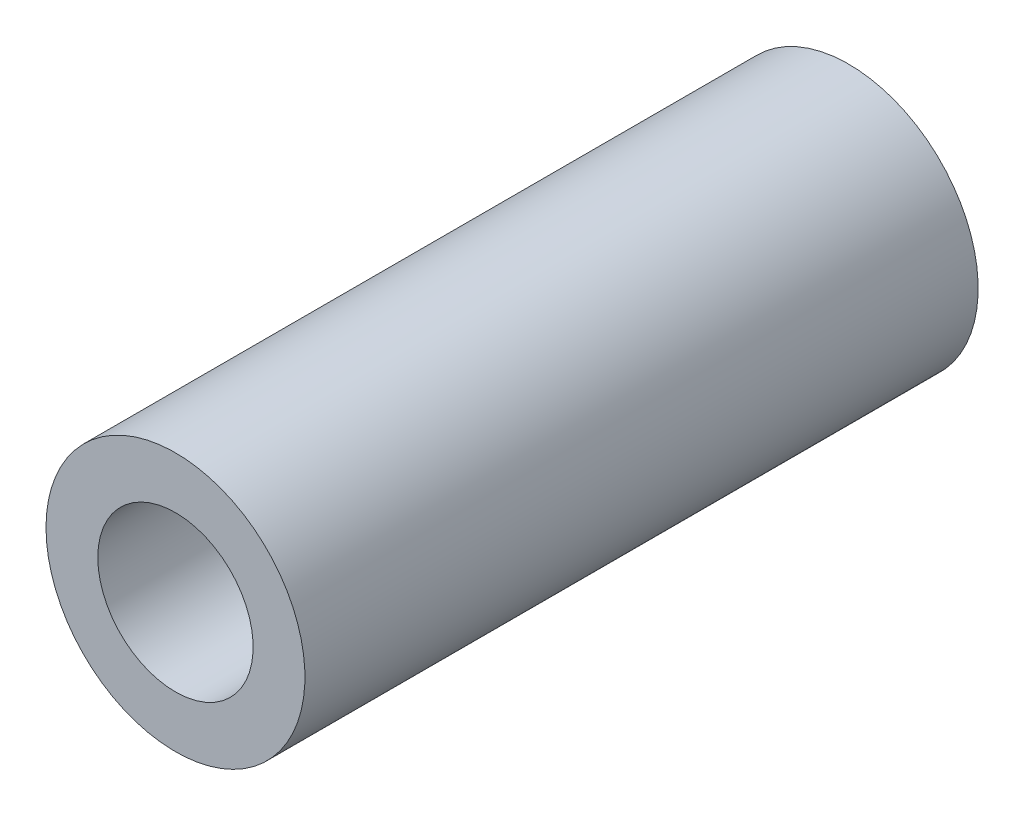
ISO-10303-21;
HEADER;
FILE_DESCRIPTION(('STEP AP214'),'2;1');
FILE_NAME('part.step','',(''),(''),'','','');
FILE_SCHEMA(('AUTOMOTIVE_DESIGN { 1 0 10303 214 1 1 1 1 }'));
ENDSEC;
DATA;
#1=APPLICATION_CONTEXT('core data for automotive mechanical design processes');
#2=APPLICATION_PROTOCOL_DEFINITION('international standard','automotive_design',2000,#1);
#3=PRODUCT_CONTEXT('',#1,'mechanical');
#4=PRODUCT('Part','Part','',(#3));
#5=PRODUCT_RELATED_PRODUCT_CATEGORY('part','',(#4));
#6=PRODUCT_DEFINITION_FORMATION('','',#4);
#7=PRODUCT_DEFINITION_CONTEXT('part definition',#1,'design');
#8=PRODUCT_DEFINITION('design','',#6,#7);
#9=PRODUCT_DEFINITION_SHAPE('','',#8);
#10=(LENGTH_UNIT() NAMED_UNIT(*) SI_UNIT(.MILLI.,.METRE.));
#11=(NAMED_UNIT(*) PLANE_ANGLE_UNIT() SI_UNIT($,.RADIAN.));
#12=(NAMED_UNIT(*) SI_UNIT($,.STERADIAN.) SOLID_ANGLE_UNIT());
#13=UNCERTAINTY_MEASURE_WITH_UNIT(LENGTH_MEASURE(1.E-05),#10,'distance_accuracy_value','');
#14=(GEOMETRIC_REPRESENTATION_CONTEXT(3) GLOBAL_UNCERTAINTY_ASSIGNED_CONTEXT((#13)) GLOBAL_UNIT_ASSIGNED_CONTEXT((#10,
#11,#12)) REPRESENTATION_CONTEXT('',''));
#15=CARTESIAN_POINT('',(0.,0.,0.));
#16=DIRECTION('',(0.,0.,1.));
#17=DIRECTION('',(1.,0.,0.));
#18=AXIS2_PLACEMENT_3D('',#15,#16,#17);
#19=CARTESIAN_POINT('',(0.,0.,6.5));
#20=DIRECTION('',(0.,0.,1.));
#21=DIRECTION('',(1.,0.,0.));
#22=AXIS2_PLACEMENT_3D('',#19,#20,#21);
#23=PLANE('',#22);
#24=CARTESIAN_POINT('',(0.,0.,6.5));
#25=DIRECTION('',(0.,0.,1.));
#26=DIRECTION('',(1.,0.,0.));
#27=AXIS2_PLACEMENT_3D('',#24,#25,#26);
#28=CIRCLE('',#27,2.5);
#29=CARTESIAN_POINT('',(-2.5,0.,6.5));
#30=VERTEX_POINT('',#29);
#31=EDGE_CURVE('E10',#30,#30,#28,.T.);
#32=ORIENTED_EDGE('',*,*,#31,.T.);
#33=EDGE_LOOP('',(#32));
#34=FACE_BOUND('',#33,.T.);
#35=CARTESIAN_POINT('',(0.,0.,6.5));
#36=DIRECTION('',(0.,0.,1.));
#37=DIRECTION('',(1.,0.,0.));
#38=AXIS2_PLACEMENT_3D('',#35,#36,#37);
#39=CIRCLE('',#38,1.5);
#40=CARTESIAN_POINT('',(-1.5,0.,6.5));
#41=VERTEX_POINT('',#40);
#42=EDGE_CURVE('E45',#41,#41,#39,.T.);
#43=ORIENTED_EDGE('',*,*,#42,.F.);
#44=EDGE_LOOP('',(#43));
#45=FACE_BOUND('',#44,.T.);
#46=ADVANCED_FACE('F34',(#34,#45),#23,.T.);
#47=CARTESIAN_POINT('',(0.,0.,-6.5));
#48=DIRECTION('',(0.,0.,1.));
#49=DIRECTION('',(1.,0.,0.));
#50=AXIS2_PLACEMENT_3D('',#47,#48,#49);
#51=PLANE('',#50);
#52=CARTESIAN_POINT('',(0.,0.,-6.5));
#53=DIRECTION('',(0.,0.,1.));
#54=DIRECTION('',(1.,0.,0.));
#55=AXIS2_PLACEMENT_3D('',#52,#53,#54);
#56=CIRCLE('',#55,2.5);
#57=CARTESIAN_POINT('',(-2.5,0.,-6.5));
#58=VERTEX_POINT('',#57);
#59=EDGE_CURVE('E38',#58,#58,#56,.T.);
#60=ORIENTED_EDGE('',*,*,#59,.F.);
#61=EDGE_LOOP('',(#60));
#62=FACE_BOUND('',#61,.T.);
#63=CARTESIAN_POINT('',(0.,0.,-6.5));
#64=DIRECTION('',(0.,0.,1.));
#65=DIRECTION('',(1.,0.,0.));
#66=AXIS2_PLACEMENT_3D('',#63,#64,#65);
#67=CIRCLE('',#66,1.5);
#68=CARTESIAN_POINT('',(-1.5,0.,-6.5));
#69=VERTEX_POINT('',#68);
#70=EDGE_CURVE('E47',#69,#69,#67,.T.);
#71=ORIENTED_EDGE('',*,*,#70,.T.);
#72=EDGE_LOOP('',(#71));
#73=FACE_BOUND('',#72,.T.);
#74=ADVANCED_FACE('F57',(#62,#73),#51,.F.);
#75=CARTESIAN_POINT('',(0.,0.,6.5));
#76=DIRECTION('',(0.,0.,-1.));
#77=DIRECTION('',(-1.,0.,0.));
#78=AXIS2_PLACEMENT_3D('',#75,#76,#77);
#79=CYLINDRICAL_SURFACE('',#78,2.5);
#80=CARTESIAN_POINT('',(-2.5,0.,6.5));
#81=CARTESIAN_POINT('',(-2.5,0.,6.36458333333333));
#82=CARTESIAN_POINT('',(-2.5,0.,6.22916666666667));
#83=CARTESIAN_POINT('',(-2.5,0.,5.95833333333333));
#84=CARTESIAN_POINT('',(-2.5,0.,5.82291666666667));
#85=CARTESIAN_POINT('',(-2.5,0.,5.55208333333333));
#86=CARTESIAN_POINT('',(-2.5,0.,5.41666666666667));
#87=CARTESIAN_POINT('',(-2.5,0.,5.14583333333333));
#88=CARTESIAN_POINT('',(-2.5,0.,5.01041666666667));
#89=CARTESIAN_POINT('',(-2.5,0.,4.73958333333333));
#90=CARTESIAN_POINT('',(-2.5,0.,4.60416666666667));
#91=CARTESIAN_POINT('',(-2.5,0.,4.33333333333333));
#92=CARTESIAN_POINT('',(-2.5,0.,4.19791666666667));
#93=CARTESIAN_POINT('',(-2.5,0.,3.92708333333333));
#94=CARTESIAN_POINT('',(-2.5,0.,3.79166666666667));
#95=CARTESIAN_POINT('',(-2.5,0.,3.52083333333333));
#96=CARTESIAN_POINT('',(-2.5,0.,3.38541666666667));
#97=CARTESIAN_POINT('',(-2.5,0.,3.11458333333333));
#98=CARTESIAN_POINT('',(-2.5,0.,2.97916666666667));
#99=CARTESIAN_POINT('',(-2.5,0.,2.70833333333333));
#100=CARTESIAN_POINT('',(-2.5,0.,2.57291666666667));
#101=CARTESIAN_POINT('',(-2.5,0.,2.30208333333333));
#102=CARTESIAN_POINT('',(-2.5,0.,2.16666666666667));
#103=CARTESIAN_POINT('',(-2.5,0.,1.89583333333333));
#104=CARTESIAN_POINT('',(-2.5,0.,1.76041666666667));
#105=CARTESIAN_POINT('',(-2.5,0.,1.48958333333333));
#106=CARTESIAN_POINT('',(-2.5,0.,1.35416666666667));
#107=CARTESIAN_POINT('',(-2.5,0.,1.08333333333333));
#108=CARTESIAN_POINT('',(-2.5,0.,0.947916666666666));
#109=CARTESIAN_POINT('',(-2.5,0.,0.677083333333332));
#110=CARTESIAN_POINT('',(-2.5,0.,0.541666666666666));
#111=CARTESIAN_POINT('',(-2.5,0.,0.270833333333333));
#112=CARTESIAN_POINT('',(-2.5,0.,0.135416666666666));
#113=CARTESIAN_POINT('',(-2.5,0.,-0.135416666666668));
#114=CARTESIAN_POINT('',(-2.5,0.,-0.270833333333334));
#115=CARTESIAN_POINT('',(-2.5,0.,-0.541666666666668));
#116=CARTESIAN_POINT('',(-2.5,0.,-0.677083333333334));
#117=CARTESIAN_POINT('',(-2.5,0.,-0.947916666666667));
#118=CARTESIAN_POINT('',(-2.5,0.,-1.08333333333333));
#119=CARTESIAN_POINT('',(-2.5,0.,-1.35416666666667));
#120=CARTESIAN_POINT('',(-2.5,0.,-1.48958333333333));
#121=CARTESIAN_POINT('',(-2.5,0.,-1.76041666666667));
#122=CARTESIAN_POINT('',(-2.5,0.,-1.89583333333333));
#123=CARTESIAN_POINT('',(-2.5,0.,-2.16666666666667));
#124=CARTESIAN_POINT('',(-2.5,0.,-2.30208333333333));
#125=CARTESIAN_POINT('',(-2.5,0.,-2.57291666666667));
#126=CARTESIAN_POINT('',(-2.5,0.,-2.70833333333333));
#127=CARTESIAN_POINT('',(-2.5,0.,-2.97916666666667));
#128=CARTESIAN_POINT('',(-2.5,0.,-3.11458333333333));
#129=CARTESIAN_POINT('',(-2.5,0.,-3.38541666666667));
#130=CARTESIAN_POINT('',(-2.5,0.,-3.52083333333333));
#131=CARTESIAN_POINT('',(-2.5,0.,-3.79166666666667));
#132=CARTESIAN_POINT('',(-2.5,0.,-3.92708333333333));
#133=CARTESIAN_POINT('',(-2.5,0.,-4.19791666666667));
#134=CARTESIAN_POINT('',(-2.5,0.,-4.33333333333333));
#135=CARTESIAN_POINT('',(-2.5,0.,-4.60416666666667));
#136=CARTESIAN_POINT('',(-2.5,0.,-4.73958333333333));
#137=CARTESIAN_POINT('',(-2.5,0.,-5.01041666666667));
#138=CARTESIAN_POINT('',(-2.5,0.,-5.14583333333333));
#139=CARTESIAN_POINT('',(-2.5,0.,-5.41666666666667));
#140=CARTESIAN_POINT('',(-2.5,0.,-5.55208333333333));
#141=CARTESIAN_POINT('',(-2.5,0.,-5.82291666666667));
#142=CARTESIAN_POINT('',(-2.5,0.,-5.95833333333333));
#143=CARTESIAN_POINT('',(-2.5,0.,-6.22916666666667));
#144=CARTESIAN_POINT('',(-2.5,0.,-6.36458333333333));
#145=CARTESIAN_POINT('',(-2.5,0.,-6.5));
#146=B_SPLINE_CURVE_WITH_KNOTS('',3,(#80,#81,#82,#83,#84,#85,#86,#87,#88,#89,#90,#91,#92,#93,
#94,#95,#96,#97,#98,#99,#100,#101,#102,#103,#104,#105,#106,#107,#108,#109,#110,#111,#112,#113,
#114,#115,#116,#117,#118,#119,#120,#121,#122,#123,#124,#125,#126,#127,#128,#129,#130,#131,#132,
#133,#134,#135,#136,#137,#138,#139,#140,#141,#142,#143,#144,#145),.UNSPECIFIED.,.F.,.F.,(4,2,2,
2,2,2,2,2,2,2,2,2,2,2,2,2,2,2,2,2,2,2,2,2,2,2,2,2,2,2,2,2,4),(0.,0.40625,0.8125,1.21875,1.625,
2.03125,2.4375,2.84375,3.25,3.65625,4.0625,4.46875,4.875,5.28125,5.6875,6.09375,6.5,6.90625,
7.3125,7.71875,8.125,8.53125,8.9375,9.34375,9.75,10.15625,10.5625,10.96875,11.375,11.78125,
12.1875,12.59375,13.),.UNSPECIFIED.);
#147=EDGE_CURVE('BSEAM36',#30,#58,#146,.T.);
#148=ORIENTED_EDGE('',*,*,#31,.F.);
#149=ORIENTED_EDGE('',*,*,#59,.T.);
#150=ORIENTED_EDGE('',*,*,#147,.T.);
#151=ORIENTED_EDGE('',*,*,#147,.F.);
#152=EDGE_LOOP('',(#148,#150,#149,#151));
#153=FACE_BOUND('',#152,.T.);
#154=ADVANCED_FACE('F36',(#153),#79,.T.);
#155=CARTESIAN_POINT('',(0.,0.,6.5));
#156=DIRECTION('',(0.,0.,-1.));
#157=DIRECTION('',(-1.,0.,0.));
#158=AXIS2_PLACEMENT_3D('',#155,#156,#157);
#159=CYLINDRICAL_SURFACE('',#158,1.5);
#160=CARTESIAN_POINT('',(-1.5,0.,6.5));
#161=CARTESIAN_POINT('',(-1.5,0.,6.36458333333333));
#162=CARTESIAN_POINT('',(-1.5,0.,6.22916666666667));
#163=CARTESIAN_POINT('',(-1.5,0.,5.95833333333333));
#164=CARTESIAN_POINT('',(-1.5,0.,5.82291666666667));
#165=CARTESIAN_POINT('',(-1.5,0.,5.55208333333333));
#166=CARTESIAN_POINT('',(-1.5,0.,5.41666666666667));
#167=CARTESIAN_POINT('',(-1.5,0.,5.14583333333333));
#168=CARTESIAN_POINT('',(-1.5,0.,5.01041666666667));
#169=CARTESIAN_POINT('',(-1.5,0.,4.73958333333333));
#170=CARTESIAN_POINT('',(-1.5,0.,4.60416666666667));
#171=CARTESIAN_POINT('',(-1.5,0.,4.33333333333333));
#172=CARTESIAN_POINT('',(-1.5,0.,4.19791666666667));
#173=CARTESIAN_POINT('',(-1.5,0.,3.92708333333333));
#174=CARTESIAN_POINT('',(-1.5,0.,3.79166666666667));
#175=CARTESIAN_POINT('',(-1.5,0.,3.52083333333333));
#176=CARTESIAN_POINT('',(-1.5,0.,3.38541666666667));
#177=CARTESIAN_POINT('',(-1.5,0.,3.11458333333333));
#178=CARTESIAN_POINT('',(-1.5,0.,2.97916666666667));
#179=CARTESIAN_POINT('',(-1.5,0.,2.70833333333333));
#180=CARTESIAN_POINT('',(-1.5,0.,2.57291666666667));
#181=CARTESIAN_POINT('',(-1.5,0.,2.30208333333333));
#182=CARTESIAN_POINT('',(-1.5,0.,2.16666666666667));
#183=CARTESIAN_POINT('',(-1.5,0.,1.89583333333333));
#184=CARTESIAN_POINT('',(-1.5,0.,1.76041666666667));
#185=CARTESIAN_POINT('',(-1.5,0.,1.48958333333333));
#186=CARTESIAN_POINT('',(-1.5,0.,1.35416666666667));
#187=CARTESIAN_POINT('',(-1.5,0.,1.08333333333333));
#188=CARTESIAN_POINT('',(-1.5,0.,0.947916666666666));
#189=CARTESIAN_POINT('',(-1.5,0.,0.677083333333332));
#190=CARTESIAN_POINT('',(-1.5,0.,0.541666666666666));
#191=CARTESIAN_POINT('',(-1.5,0.,0.270833333333333));
#192=CARTESIAN_POINT('',(-1.5,0.,0.135416666666666));
#193=CARTESIAN_POINT('',(-1.5,0.,-0.135416666666668));
#194=CARTESIAN_POINT('',(-1.5,0.,-0.270833333333334));
#195=CARTESIAN_POINT('',(-1.5,0.,-0.541666666666668));
#196=CARTESIAN_POINT('',(-1.5,0.,-0.677083333333334));
#197=CARTESIAN_POINT('',(-1.5,0.,-0.947916666666667));
#198=CARTESIAN_POINT('',(-1.5,0.,-1.08333333333333));
#199=CARTESIAN_POINT('',(-1.5,0.,-1.35416666666667));
#200=CARTESIAN_POINT('',(-1.5,0.,-1.48958333333333));
#201=CARTESIAN_POINT('',(-1.5,0.,-1.76041666666667));
#202=CARTESIAN_POINT('',(-1.5,0.,-1.89583333333333));
#203=CARTESIAN_POINT('',(-1.5,0.,-2.16666666666667));
#204=CARTESIAN_POINT('',(-1.5,0.,-2.30208333333333));
#205=CARTESIAN_POINT('',(-1.5,0.,-2.57291666666667));
#206=CARTESIAN_POINT('',(-1.5,0.,-2.70833333333333));
#207=CARTESIAN_POINT('',(-1.5,0.,-2.97916666666667));
#208=CARTESIAN_POINT('',(-1.5,0.,-3.11458333333333));
#209=CARTESIAN_POINT('',(-1.5,0.,-3.38541666666667));
#210=CARTESIAN_POINT('',(-1.5,0.,-3.52083333333333));
#211=CARTESIAN_POINT('',(-1.5,0.,-3.79166666666667));
#212=CARTESIAN_POINT('',(-1.5,0.,-3.92708333333333));
#213=CARTESIAN_POINT('',(-1.5,0.,-4.19791666666667));
#214=CARTESIAN_POINT('',(-1.5,0.,-4.33333333333333));
#215=CARTESIAN_POINT('',(-1.5,0.,-4.60416666666667));
#216=CARTESIAN_POINT('',(-1.5,0.,-4.73958333333333));
#217=CARTESIAN_POINT('',(-1.5,0.,-5.01041666666667));
#218=CARTESIAN_POINT('',(-1.5,0.,-5.14583333333333));
#219=CARTESIAN_POINT('',(-1.5,0.,-5.41666666666667));
#220=CARTESIAN_POINT('',(-1.5,0.,-5.55208333333333));
#221=CARTESIAN_POINT('',(-1.5,0.,-5.82291666666667));
#222=CARTESIAN_POINT('',(-1.5,0.,-5.95833333333333));
#223=CARTESIAN_POINT('',(-1.5,0.,-6.22916666666667));
#224=CARTESIAN_POINT('',(-1.5,0.,-6.36458333333333));
#225=CARTESIAN_POINT('',(-1.5,0.,-6.5));
#226=B_SPLINE_CURVE_WITH_KNOTS('',3,(#160,#161,#162,#163,#164,#165,#166,#167,#168,#169,#170,
#171,#172,#173,#174,#175,#176,#177,#178,#179,#180,#181,#182,#183,#184,#185,#186,#187,#188,#189,
#190,#191,#192,#193,#194,#195,#196,#197,#198,#199,#200,#201,#202,#203,#204,#205,#206,#207,#208,
#209,#210,#211,#212,#213,#214,#215,#216,#217,#218,#219,#220,#221,#222,#223,#224,#225),
.UNSPECIFIED.,.F.,.F.,(4,2,2,2,2,2,2,2,2,2,2,2,2,2,2,2,2,2,2,2,2,2,2,2,2,2,2,2,2,2,2,2,4),(0.,
0.40625,0.8125,1.21875,1.625,2.03125,2.4375,2.84375,3.25,3.65625,4.0625,4.46875,4.875,5.28125,
5.6875,6.09375,6.5,6.90625,7.3125,7.71875,8.125,8.53125,8.9375,9.34375,9.75,10.15625,10.5625,
10.96875,11.375,11.78125,12.1875,12.59375,13.),.UNSPECIFIED.);
#227=EDGE_CURVE('BSEAM53',#41,#69,#226,.T.);
#228=ORIENTED_EDGE('',*,*,#42,.T.);
#229=ORIENTED_EDGE('',*,*,#70,.F.);
#230=ORIENTED_EDGE('',*,*,#227,.T.);
#231=ORIENTED_EDGE('',*,*,#227,.F.);
#232=EDGE_LOOP('',(#228,#230,#229,#231));
#233=FACE_BOUND('',#232,.T.);
#234=ADVANCED_FACE('F53',(#233),#159,.F.);
#235=CLOSED_SHELL('',(#46,#74,#154,#234));
#236=MANIFOLD_SOLID_BREP('B2',#235);
#237=ADVANCED_BREP_SHAPE_REPRESENTATION('',(#18,#236),#14);
#238=SHAPE_DEFINITION_REPRESENTATION(#9,#237);
ENDSEC;
END-ISO-10303-21;
